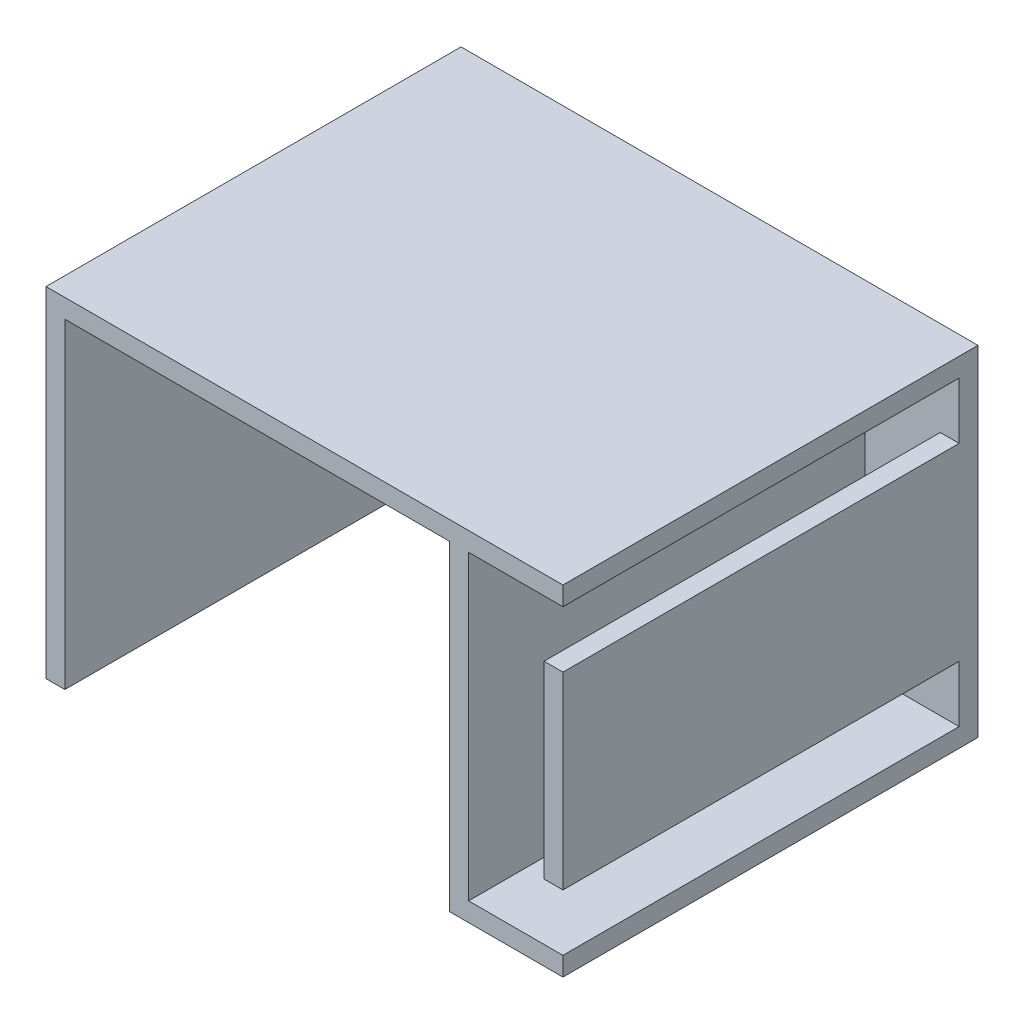
ISO-10303-21;
HEADER;
FILE_DESCRIPTION(('STEP AP214'),'2;1');
FILE_NAME('part.step','',(''),(''),'','','');
FILE_SCHEMA(('AUTOMOTIVE_DESIGN { 1 0 10303 214 1 1 1 1 }'));
ENDSEC;
DATA;
#1=APPLICATION_CONTEXT('core data for automotive mechanical design processes');
#2=APPLICATION_PROTOCOL_DEFINITION('international standard','automotive_design',2000,#1);
#3=PRODUCT_CONTEXT('',#1,'mechanical');
#4=PRODUCT('Part','Part','',(#3));
#5=PRODUCT_RELATED_PRODUCT_CATEGORY('part','',(#4));
#6=PRODUCT_DEFINITION_FORMATION('','',#4);
#7=PRODUCT_DEFINITION_CONTEXT('part definition',#1,'design');
#8=PRODUCT_DEFINITION('design','',#6,#7);
#9=PRODUCT_DEFINITION_SHAPE('','',#8);
#10=(LENGTH_UNIT() NAMED_UNIT(*) SI_UNIT(.MILLI.,.METRE.));
#11=(NAMED_UNIT(*) PLANE_ANGLE_UNIT() SI_UNIT($,.RADIAN.));
#12=(NAMED_UNIT(*) SI_UNIT($,.STERADIAN.) SOLID_ANGLE_UNIT());
#13=UNCERTAINTY_MEASURE_WITH_UNIT(LENGTH_MEASURE(1.E-05),#10,'distance_accuracy_value','');
#14=(GEOMETRIC_REPRESENTATION_CONTEXT(3) GLOBAL_UNCERTAINTY_ASSIGNED_CONTEXT((#13)) GLOBAL_UNIT_ASSIGNED_CONTEXT((#10,
#11,#12)) REPRESENTATION_CONTEXT('',''));
#15=CARTESIAN_POINT('',(0.,0.,0.));
#16=DIRECTION('',(0.,0.,1.));
#17=DIRECTION('',(1.,0.,0.));
#18=AXIS2_PLACEMENT_3D('',#15,#16,#17);
#19=CARTESIAN_POINT('',(22.4,0.,22.));
#20=DIRECTION('',(0.,0.,-1.));
#21=DIRECTION('',(1.,0.,0.));
#22=AXIS2_PLACEMENT_3D('',#19,#20,#21);
#23=PLANE('',#22);
#24=DIRECTION('',(0.,-1.,0.));
#25=VECTOR('',#24,1.);
#26=CARTESIAN_POINT('',(38.6,10.1,22.));
#27=LINE('',#26,#25);
#28=CARTESIAN_POINT('',(38.6,7.10000000000001,22.));
#29=VERTEX_POINT('',#28);
#30=CARTESIAN_POINT('',(38.6,-2.9,22.));
#31=VERTEX_POINT('',#30);
#32=EDGE_CURVE('E223',#29,#31,#27,.T.);
#33=ORIENTED_EDGE('',*,*,#32,.F.);
#34=DIRECTION('',(1.,0.,0.));
#35=VECTOR('',#34,1.);
#36=CARTESIAN_POINT('',(11.199,7.10000000000002,22.));
#37=LINE('',#36,#35);
#38=CARTESIAN_POINT('',(37.6,7.10000000000001,22.));
#39=VERTEX_POINT('',#38);
#40=EDGE_CURVE('E175',#39,#29,#37,.T.);
#41=ORIENTED_EDGE('',*,*,#40,.F.);
#42=DIRECTION('',(0.,1.,0.));
#43=VECTOR('',#42,1.);
#44=CARTESIAN_POINT('',(37.6,-5.89999999999999,22.));
#45=LINE('',#44,#43);
#46=CARTESIAN_POINT('',(37.6,-2.89999999999999,22.));
#47=VERTEX_POINT('',#46);
#48=EDGE_CURVE('E216',#47,#39,#45,.T.);
#49=ORIENTED_EDGE('',*,*,#48,.F.);
#50=DIRECTION('',(1.,0.,0.));
#51=VECTOR('',#50,1.);
#52=CARTESIAN_POINT('',(11.199,-2.89999999999999,22.));
#53=LINE('',#52,#51);
#54=EDGE_CURVE('E164',#47,#31,#53,.T.);
#55=ORIENTED_EDGE('',*,*,#54,.T.);
#56=EDGE_LOOP('',(#33,#41,#49,#55));
#57=FACE_BOUND('',#56,.T.);
#58=ADVANCED_FACE('F39',(#57),#23,.F.);
#59=CARTESIAN_POINT('',(32.6,-6.9,22.));
#60=DIRECTION('',(1.,0.,0.));
#61=DIRECTION('',(0.,-1.,0.));
#62=AXIS2_PLACEMENT_3D('',#59,#60,#61);
#63=PLANE('',#62);
#64=DIRECTION('',(0.,1.,0.));
#65=VECTOR('',#64,1.);
#66=CARTESIAN_POINT('',(32.6,-6.9,0.));
#67=LINE('',#66,#65);
#68=CARTESIAN_POINT('',(32.6,-6.9,0.));
#69=VERTEX_POINT('',#68);
#70=CARTESIAN_POINT('',(32.6,10.1,0.));
#71=VERTEX_POINT('',#70);
#72=EDGE_CURVE('E190',#69,#71,#67,.T.);
#73=ORIENTED_EDGE('',*,*,#72,.F.);
#74=DIRECTION('',(0.,0.,-1.));
#75=VECTOR('',#74,1.);
#76=CARTESIAN_POINT('',(32.6,-6.9,22.));
#77=LINE('',#76,#75);
#78=CARTESIAN_POINT('',(32.6,-6.9,22.));
#79=VERTEX_POINT('',#78);
#80=EDGE_CURVE('E225',#79,#69,#77,.T.);
#81=ORIENTED_EDGE('',*,*,#80,.F.);
#82=DIRECTION('',(0.,1.,0.));
#83=VECTOR('',#82,1.);
#84=CARTESIAN_POINT('',(32.6,-6.9,22.));
#85=LINE('',#84,#83);
#86=CARTESIAN_POINT('',(32.6,10.1,22.));
#87=VERTEX_POINT('',#86);
#88=EDGE_CURVE('E191',#79,#87,#85,.T.);
#89=ORIENTED_EDGE('',*,*,#88,.T.);
#90=DIRECTION('',(0.,0.,-1.));
#91=VECTOR('',#90,1.);
#92=CARTESIAN_POINT('',(32.6,10.1,22.));
#93=LINE('',#92,#91);
#94=EDGE_CURVE('E11',#87,#71,#93,.T.);
#95=ORIENTED_EDGE('',*,*,#94,.T.);
#96=EDGE_LOOP('',(#73,#81,#89,#95));
#97=FACE_BOUND('',#96,.T.);
#98=ADVANCED_FACE('F41',(#97),#63,.F.);
#99=CARTESIAN_POINT('',(32.6,10.1,22.));
#100=DIRECTION('',(0.,1.,0.));
#101=DIRECTION('',(0.,0.,1.));
#102=AXIS2_PLACEMENT_3D('',#99,#100,#101);
#103=PLANE('',#102);
#104=DIRECTION('',(-1.,0.,0.));
#105=VECTOR('',#104,1.);
#106=CARTESIAN_POINT('',(32.6,10.1,0.));
#107=LINE('',#106,#105);
#108=CARTESIAN_POINT('',(12.2,10.1,0.));
#109=VERTEX_POINT('',#108);
#110=EDGE_CURVE('E228',#71,#109,#107,.T.);
#111=ORIENTED_EDGE('',*,*,#110,.F.);
#112=ORIENTED_EDGE('',*,*,#94,.F.);
#113=DIRECTION('',(-1.,0.,0.));
#114=VECTOR('',#113,1.);
#115=CARTESIAN_POINT('',(32.6,10.1,22.));
#116=LINE('',#115,#114);
#117=CARTESIAN_POINT('',(12.2,10.1,22.));
#118=VERTEX_POINT('',#117);
#119=EDGE_CURVE('E194',#87,#118,#116,.T.);
#120=ORIENTED_EDGE('',*,*,#119,.T.);
#121=DIRECTION('',(0.,0.,-1.));
#122=VECTOR('',#121,1.);
#123=CARTESIAN_POINT('',(12.2,10.1,22.));
#124=LINE('',#123,#122);
#125=EDGE_CURVE('E47',#118,#109,#124,.T.);
#126=ORIENTED_EDGE('',*,*,#125,.T.);
#127=EDGE_LOOP('',(#111,#112,#120,#126));
#128=FACE_BOUND('',#127,.T.);
#129=ADVANCED_FACE('F266',(#128),#103,.F.);
#130=CARTESIAN_POINT('',(12.2,10.1,22.));
#131=DIRECTION('',(-1.,0.,0.));
#132=DIRECTION('',(0.,0.,-1.));
#133=AXIS2_PLACEMENT_3D('',#130,#131,#132);
#134=PLANE('',#133);
#135=DIRECTION('',(0.,-1.,0.));
#136=VECTOR('',#135,1.);
#137=CARTESIAN_POINT('',(12.2,10.1,0.));
#138=LINE('',#137,#136);
#139=CARTESIAN_POINT('',(12.2,-6.9,0.));
#140=VERTEX_POINT('',#139);
#141=EDGE_CURVE('E231',#109,#140,#138,.T.);
#142=ORIENTED_EDGE('',*,*,#141,.F.);
#143=ORIENTED_EDGE('',*,*,#125,.F.);
#144=DIRECTION('',(0.,-1.,0.));
#145=VECTOR('',#144,1.);
#146=CARTESIAN_POINT('',(12.2,10.1,22.));
#147=LINE('',#146,#145);
#148=CARTESIAN_POINT('',(12.2,-6.9,22.));
#149=VERTEX_POINT('',#148);
#150=EDGE_CURVE('E198',#118,#149,#147,.T.);
#151=ORIENTED_EDGE('',*,*,#150,.T.);
#152=DIRECTION('',(0.,0.,-1.));
#153=VECTOR('',#152,1.);
#154=CARTESIAN_POINT('',(12.2,-6.9,22.));
#155=LINE('',#154,#153);
#156=EDGE_CURVE('E261',#149,#140,#155,.T.);
#157=ORIENTED_EDGE('',*,*,#156,.T.);
#158=EDGE_LOOP('',(#142,#143,#151,#157));
#159=FACE_BOUND('',#158,.T.);
#160=ADVANCED_FACE('F279',(#159),#134,.F.);
#161=CARTESIAN_POINT('',(12.2,-6.9,22.));
#162=DIRECTION('',(0.,1.,0.));
#163=DIRECTION('',(1.,0.,0.));
#164=AXIS2_PLACEMENT_3D('',#161,#162,#163);
#165=PLANE('',#164);
#166=DIRECTION('',(-1.,0.,0.));
#167=VECTOR('',#166,1.);
#168=CARTESIAN_POINT('',(12.2,-6.9,0.));
#169=LINE('',#168,#167);
#170=CARTESIAN_POINT('',(11.2,-6.9,0.));
#171=VERTEX_POINT('',#170);
#172=EDGE_CURVE('E234',#140,#171,#169,.T.);
#173=ORIENTED_EDGE('',*,*,#172,.F.);
#174=ORIENTED_EDGE('',*,*,#156,.F.);
#175=DIRECTION('',(-1.,0.,0.));
#176=VECTOR('',#175,1.);
#177=CARTESIAN_POINT('',(12.2,-6.9,22.));
#178=LINE('',#177,#176);
#179=CARTESIAN_POINT('',(11.2,-6.9,22.));
#180=VERTEX_POINT('',#179);
#181=EDGE_CURVE('E201',#149,#180,#178,.T.);
#182=ORIENTED_EDGE('',*,*,#181,.T.);
#183=DIRECTION('',(0.,0.,-1.));
#184=VECTOR('',#183,1.);
#185=CARTESIAN_POINT('',(11.2,-6.9,22.));
#186=LINE('',#185,#184);
#187=EDGE_CURVE('E258',#180,#171,#186,.T.);
#188=ORIENTED_EDGE('',*,*,#187,.T.);
#189=EDGE_LOOP('',(#173,#174,#182,#188));
#190=FACE_BOUND('',#189,.T.);
#191=ADVANCED_FACE('F281',(#190),#165,.F.);
#192=CARTESIAN_POINT('',(11.2,-6.9,22.));
#193=DIRECTION('',(1.,0.,0.));
#194=DIRECTION('',(0.,-1.,0.));
#195=AXIS2_PLACEMENT_3D('',#192,#193,#194);
#196=PLANE('',#195);
#197=DIRECTION('',(0.,1.,0.));
#198=VECTOR('',#197,1.);
#199=CARTESIAN_POINT('',(11.2,-6.9,0.));
#200=LINE('',#199,#198);
#201=CARTESIAN_POINT('',(11.2,11.1,0.));
#202=VERTEX_POINT('',#201);
#203=EDGE_CURVE('E237',#171,#202,#200,.T.);
#204=ORIENTED_EDGE('',*,*,#203,.F.);
#205=ORIENTED_EDGE('',*,*,#187,.F.);
#206=DIRECTION('',(0.,1.,0.));
#207=VECTOR('',#206,1.);
#208=CARTESIAN_POINT('',(11.2,-6.9,22.));
#209=LINE('',#208,#207);
#210=CARTESIAN_POINT('',(11.2,11.1,22.));
#211=VERTEX_POINT('',#210);
#212=EDGE_CURVE('E204',#180,#211,#209,.T.);
#213=ORIENTED_EDGE('',*,*,#212,.T.);
#214=DIRECTION('',(0.,0.,-1.));
#215=VECTOR('',#214,1.);
#216=CARTESIAN_POINT('',(11.2,11.1,22.));
#217=LINE('',#216,#215);
#218=EDGE_CURVE('E255',#211,#202,#217,.T.);
#219=ORIENTED_EDGE('',*,*,#218,.T.);
#220=EDGE_LOOP('',(#204,#205,#213,#219));
#221=FACE_BOUND('',#220,.T.);
#222=ADVANCED_FACE('F284',(#221),#196,.F.);
#223=CARTESIAN_POINT('',(11.2,11.1,22.));
#224=DIRECTION('',(0.,-1.,0.));
#225=DIRECTION('',(-1.,0.,0.));
#226=AXIS2_PLACEMENT_3D('',#223,#224,#225);
#227=PLANE('',#226);
#228=DIRECTION('',(1.,0.,0.));
#229=VECTOR('',#228,1.);
#230=CARTESIAN_POINT('',(11.2,11.1,0.));
#231=LINE('',#230,#229);
#232=CARTESIAN_POINT('',(38.6,11.1,0.));
#233=VERTEX_POINT('',#232);
#234=EDGE_CURVE('E240',#202,#233,#231,.T.);
#235=ORIENTED_EDGE('',*,*,#234,.F.);
#236=ORIENTED_EDGE('',*,*,#218,.F.);
#237=DIRECTION('',(1.,0.,0.));
#238=VECTOR('',#237,1.);
#239=CARTESIAN_POINT('',(11.2,11.1,22.));
#240=LINE('',#239,#238);
#241=CARTESIAN_POINT('',(38.6,11.1,22.));
#242=VERTEX_POINT('',#241);
#243=EDGE_CURVE('E207',#211,#242,#240,.T.);
#244=ORIENTED_EDGE('',*,*,#243,.T.);
#245=DIRECTION('',(0.,0.,1.));
#246=VECTOR('',#245,1.);
#247=CARTESIAN_POINT('',(38.6,11.1,-5.09901951359278));
#248=LINE('',#247,#246);
#249=EDGE_CURVE('E184',#233,#242,#248,.T.);
#250=ORIENTED_EDGE('',*,*,#249,.F.);
#251=EDGE_LOOP('',(#235,#236,#244,#250));
#252=FACE_BOUND('',#251,.T.);
#253=ADVANCED_FACE('F287',(#252),#227,.F.);
#254=CARTESIAN_POINT('',(33.6,11.1,22.));
#255=DIRECTION('',(-1.,0.,0.));
#256=DIRECTION('',(0.,0.,-1.));
#257=AXIS2_PLACEMENT_3D('',#254,#255,#256);
#258=PLANE('',#257);
#259=DIRECTION('',(0.,-1.,0.));
#260=VECTOR('',#259,1.);
#261=CARTESIAN_POINT('',(33.6,11.1,22.));
#262=LINE('',#261,#260);
#263=CARTESIAN_POINT('',(33.6,10.1,22.));
#264=VERTEX_POINT('',#263);
#265=CARTESIAN_POINT('',(33.6,-5.89999999999999,22.));
#266=VERTEX_POINT('',#265);
#267=EDGE_CURVE('E210',#264,#266,#262,.T.);
#268=ORIENTED_EDGE('',*,*,#267,.T.);
#269=DIRECTION('',(0.,0.,-1.));
#270=VECTOR('',#269,1.);
#271=CARTESIAN_POINT('',(33.6,-5.89999999999999,22.));
#272=LINE('',#271,#270);
#273=CARTESIAN_POINT('',(33.6,-5.89999999999999,1.));
#274=VERTEX_POINT('',#273);
#275=EDGE_CURVE('E252',#266,#274,#272,.T.);
#276=ORIENTED_EDGE('',*,*,#275,.T.);
#277=DIRECTION('',(0.,-1.,0.));
#278=VECTOR('',#277,1.);
#279=CARTESIAN_POINT('',(33.6,10.1,1.));
#280=LINE('',#279,#278);
#281=CARTESIAN_POINT('',(33.6,10.1,0.999999999999998));
#282=VERTEX_POINT('',#281);
#283=EDGE_CURVE('E182',#282,#274,#280,.T.);
#284=ORIENTED_EDGE('',*,*,#283,.F.);
#285=DIRECTION('',(0.,0.,1.));
#286=VECTOR('',#285,1.);
#287=CARTESIAN_POINT('',(33.6,10.1,-5.09901951359278));
#288=LINE('',#287,#286);
#289=EDGE_CURVE('E180',#282,#264,#288,.T.);
#290=ORIENTED_EDGE('',*,*,#289,.T.);
#291=EDGE_LOOP('',(#268,#276,#284,#290));
#292=FACE_BOUND('',#291,.T.);
#293=ADVANCED_FACE('F325',(#292),#258,.F.);
#294=CARTESIAN_POINT('',(33.6,-5.89999999999999,22.));
#295=DIRECTION('',(0.,-1.,0.));
#296=DIRECTION('',(-1.,0.,0.));
#297=AXIS2_PLACEMENT_3D('',#294,#295,#296);
#298=PLANE('',#297);
#299=ORIENTED_EDGE('',*,*,#275,.F.);
#300=DIRECTION('',(1.,0.,0.));
#301=VECTOR('',#300,1.);
#302=CARTESIAN_POINT('',(33.6,-5.89999999999999,22.));
#303=LINE('',#302,#301);
#304=CARTESIAN_POINT('',(38.6,-5.9,22.));
#305=VERTEX_POINT('',#304);
#306=EDGE_CURVE('E213',#266,#305,#303,.T.);
#307=ORIENTED_EDGE('',*,*,#306,.T.);
#308=DIRECTION('',(0.,0.,1.));
#309=VECTOR('',#308,1.);
#310=CARTESIAN_POINT('',(38.6,-5.9,1.));
#311=LINE('',#310,#309);
#312=CARTESIAN_POINT('',(38.6,-5.9,1.));
#313=VERTEX_POINT('',#312);
#314=EDGE_CURVE('E165',#313,#305,#311,.T.);
#315=ORIENTED_EDGE('',*,*,#314,.F.);
#316=DIRECTION('',(1.,0.,0.));
#317=VECTOR('',#316,1.);
#318=CARTESIAN_POINT('',(37.6,-5.89999999999999,1.));
#319=LINE('',#318,#317);
#320=EDGE_CURVE('E62',#274,#313,#319,.T.);
#321=ORIENTED_EDGE('',*,*,#320,.F.);
#322=EDGE_LOOP('',(#299,#307,#315,#321));
#323=FACE_BOUND('',#322,.T.);
#324=ADVANCED_FACE('F312',(#323),#298,.F.);
#325=CARTESIAN_POINT('',(37.6,-5.89999999999999,22.));
#326=DIRECTION('',(1.,0.,0.));
#327=DIRECTION('',(0.,-1.,0.));
#328=AXIS2_PLACEMENT_3D('',#325,#326,#327);
#329=PLANE('',#328);
#330=ORIENTED_EDGE('',*,*,#48,.T.);
#331=DIRECTION('',(0.,0.,-1.));
#332=VECTOR('',#331,1.);
#333=CARTESIAN_POINT('',(37.6,7.10000000000001,22.));
#334=LINE('',#333,#332);
#335=CARTESIAN_POINT('',(37.6,7.10000000000001,1.));
#336=VERTEX_POINT('',#335);
#337=EDGE_CURVE('E178',#39,#336,#334,.T.);
#338=ORIENTED_EDGE('',*,*,#337,.T.);
#339=DIRECTION('',(0.,1.,0.));
#340=VECTOR('',#339,1.);
#341=CARTESIAN_POINT('',(37.6,10.1,1.));
#342=LINE('',#341,#340);
#343=CARTESIAN_POINT('',(37.6,-2.9,1.));
#344=VERTEX_POINT('',#343);
#345=EDGE_CURVE('E159',#344,#336,#342,.T.);
#346=ORIENTED_EDGE('',*,*,#345,.F.);
#347=DIRECTION('',(0.,0.,1.));
#348=VECTOR('',#347,1.);
#349=CARTESIAN_POINT('',(37.6,-2.9,1.));
#350=LINE('',#349,#348);
#351=EDGE_CURVE('E168',#344,#47,#350,.T.);
#352=ORIENTED_EDGE('',*,*,#351,.T.);
#353=EDGE_LOOP('',(#330,#338,#346,#352));
#354=FACE_BOUND('',#353,.T.);
#355=ADVANCED_FACE('F177',(#354),#329,.F.);
#356=CARTESIAN_POINT('',(38.6,10.1,22.));
#357=DIRECTION('',(-1.,0.,0.));
#358=DIRECTION('',(0.,0.,-1.));
#359=AXIS2_PLACEMENT_3D('',#356,#357,#358);
#360=PLANE('',#359);
#361=DIRECTION('',(0.,-1.,0.));
#362=VECTOR('',#361,1.);
#363=CARTESIAN_POINT('',(38.6,-5.9,1.));
#364=LINE('',#363,#362);
#365=CARTESIAN_POINT('',(38.6,-2.9,1.));
#366=VERTEX_POINT('',#365);
#367=EDGE_CURVE('E161',#366,#313,#364,.T.);
#368=ORIENTED_EDGE('',*,*,#367,.T.);
#369=ORIENTED_EDGE('',*,*,#314,.T.);
#370=CARTESIAN_POINT('',(38.6,-6.90000000000001,22.));
#371=VERTEX_POINT('',#370);
#372=EDGE_CURVE('E218',#305,#371,#27,.T.);
#373=ORIENTED_EDGE('',*,*,#372,.T.);
#374=DIRECTION('',(0.,0.,-1.));
#375=VECTOR('',#374,1.);
#376=CARTESIAN_POINT('',(38.6,-6.90000000000001,22.));
#377=LINE('',#376,#375);
#378=CARTESIAN_POINT('',(38.6,-6.90000000000001,0.));
#379=VERTEX_POINT('',#378);
#380=EDGE_CURVE('E249',#371,#379,#377,.T.);
#381=ORIENTED_EDGE('',*,*,#380,.T.);
#382=DIRECTION('',(0.,-1.,0.));
#383=VECTOR('',#382,1.);
#384=CARTESIAN_POINT('',(38.6,10.1,0.));
#385=LINE('',#384,#383);
#386=EDGE_CURVE('E243',#233,#379,#385,.T.);
#387=ORIENTED_EDGE('',*,*,#386,.F.);
#388=ORIENTED_EDGE('',*,*,#249,.T.);
#389=CARTESIAN_POINT('',(38.6,10.1,22.));
#390=VERTEX_POINT('',#389);
#391=EDGE_CURVE('E219',#242,#390,#27,.T.);
#392=ORIENTED_EDGE('',*,*,#391,.T.);
#393=DIRECTION('',(0.,0.,-1.));
#394=VECTOR('',#393,1.);
#395=CARTESIAN_POINT('',(38.6,10.1,22.));
#396=LINE('',#395,#394);
#397=CARTESIAN_POINT('',(38.6,10.1,1.));
#398=VERTEX_POINT('',#397);
#399=EDGE_CURVE('E300',#390,#398,#396,.T.);
#400=ORIENTED_EDGE('',*,*,#399,.T.);
#401=DIRECTION('',(0.,-1.,0.));
#402=VECTOR('',#401,1.);
#403=CARTESIAN_POINT('',(38.6,10.1,1.));
#404=LINE('',#403,#402);
#405=CARTESIAN_POINT('',(38.6,7.10000000000001,1.));
#406=VERTEX_POINT('',#405);
#407=EDGE_CURVE('E303',#398,#406,#404,.T.);
#408=ORIENTED_EDGE('',*,*,#407,.T.);
#409=DIRECTION('',(0.,0.,1.));
#410=VECTOR('',#409,1.);
#411=CARTESIAN_POINT('',(38.6,7.10000000000001,22.));
#412=LINE('',#411,#410);
#413=EDGE_CURVE('E296',#406,#29,#412,.T.);
#414=ORIENTED_EDGE('',*,*,#413,.T.);
#415=ORIENTED_EDGE('',*,*,#32,.T.);
#416=DIRECTION('',(0.,0.,-1.));
#417=VECTOR('',#416,1.);
#418=CARTESIAN_POINT('',(38.6,-2.9,1.));
#419=LINE('',#418,#417);
#420=EDGE_CURVE('E174',#31,#366,#419,.T.);
#421=ORIENTED_EDGE('',*,*,#420,.T.);
#422=EDGE_LOOP('',(#368,#369,#373,#381,#387,#388,#392,#400,#408,#414,#415,#421));
#423=FACE_BOUND('',#422,.T.);
#424=ADVANCED_FACE('F311',(#423),#360,.F.);
#425=CARTESIAN_POINT('',(32.6,-6.9,22.));
#426=DIRECTION('',(0.,1.,0.));
#427=DIRECTION('',(1.,0.,0.));
#428=AXIS2_PLACEMENT_3D('',#425,#426,#427);
#429=PLANE('',#428);
#430=DIRECTION('',(-1.,0.,0.));
#431=VECTOR('',#430,1.);
#432=CARTESIAN_POINT('',(32.6,-6.9,0.));
#433=LINE('',#432,#431);
#434=EDGE_CURVE('E195',#379,#69,#433,.T.);
#435=ORIENTED_EDGE('',*,*,#434,.F.);
#436=ORIENTED_EDGE('',*,*,#380,.F.);
#437=DIRECTION('',(-1.,0.,0.));
#438=VECTOR('',#437,1.);
#439=CARTESIAN_POINT('',(32.6,-6.9,22.));
#440=LINE('',#439,#438);
#441=EDGE_CURVE('E222',#371,#79,#440,.T.);
#442=ORIENTED_EDGE('',*,*,#441,.T.);
#443=ORIENTED_EDGE('',*,*,#80,.T.);
#444=EDGE_LOOP('',(#435,#436,#442,#443));
#445=FACE_BOUND('',#444,.T.);
#446=ADVANCED_FACE('F342',(#445),#429,.F.);
#447=ORIENTED_EDGE('',*,*,#306,.F.);
#448=ORIENTED_EDGE('',*,*,#267,.F.);
#449=DIRECTION('',(-1.,0.,0.));
#450=VECTOR('',#449,1.);
#451=CARTESIAN_POINT('',(33.6,10.1,22.));
#452=LINE('',#451,#450);
#453=EDGE_CURVE('E54',#390,#264,#452,.T.);
#454=ORIENTED_EDGE('',*,*,#453,.F.);
#455=ORIENTED_EDGE('',*,*,#391,.F.);
#456=ORIENTED_EDGE('',*,*,#243,.F.);
#457=ORIENTED_EDGE('',*,*,#212,.F.);
#458=ORIENTED_EDGE('',*,*,#181,.F.);
#459=ORIENTED_EDGE('',*,*,#150,.F.);
#460=ORIENTED_EDGE('',*,*,#119,.F.);
#461=ORIENTED_EDGE('',*,*,#88,.F.);
#462=ORIENTED_EDGE('',*,*,#441,.F.);
#463=ORIENTED_EDGE('',*,*,#372,.F.);
#464=EDGE_LOOP('',(#447,#448,#454,#455,#456,#457,#458,#459,#460,#461,#462,#463));
#465=FACE_BOUND('',#464,.T.);
#466=ADVANCED_FACE('F276',(#465),#23,.F.);
#467=CARTESIAN_POINT('',(22.4,0.,0.));
#468=DIRECTION('',(0.,0.,-1.));
#469=DIRECTION('',(1.,0.,0.));
#470=AXIS2_PLACEMENT_3D('',#467,#468,#469);
#471=PLANE('',#470);
#472=ORIENTED_EDGE('',*,*,#386,.T.);
#473=ORIENTED_EDGE('',*,*,#434,.T.);
#474=ORIENTED_EDGE('',*,*,#72,.T.);
#475=ORIENTED_EDGE('',*,*,#110,.T.);
#476=ORIENTED_EDGE('',*,*,#141,.T.);
#477=ORIENTED_EDGE('',*,*,#172,.T.);
#478=ORIENTED_EDGE('',*,*,#203,.T.);
#479=ORIENTED_EDGE('',*,*,#234,.T.);
#480=EDGE_LOOP('',(#472,#473,#474,#475,#476,#477,#478,#479));
#481=FACE_BOUND('',#480,.T.);
#482=ADVANCED_FACE('F270',(#481),#471,.T.);
#483=CARTESIAN_POINT('',(22.4,0.,1.));
#484=DIRECTION('',(0.,0.,1.));
#485=DIRECTION('',(-1.,0.,0.));
#486=AXIS2_PLACEMENT_3D('',#483,#484,#485);
#487=PLANE('',#486);
#488=ORIENTED_EDGE('',*,*,#345,.T.);
#489=DIRECTION('',(1.,0.,0.));
#490=VECTOR('',#489,1.);
#491=CARTESIAN_POINT('',(11.199,7.10000000000001,1.));
#492=LINE('',#491,#490);
#493=EDGE_CURVE('E294',#336,#406,#492,.T.);
#494=ORIENTED_EDGE('',*,*,#493,.T.);
#495=ORIENTED_EDGE('',*,*,#407,.F.);
#496=DIRECTION('',(-1.,0.,0.));
#497=VECTOR('',#496,1.);
#498=CARTESIAN_POINT('',(37.6,10.1,1.));
#499=LINE('',#498,#497);
#500=EDGE_CURVE('E179',#398,#282,#499,.T.);
#501=ORIENTED_EDGE('',*,*,#500,.T.);
#502=ORIENTED_EDGE('',*,*,#283,.T.);
#503=ORIENTED_EDGE('',*,*,#320,.T.);
#504=ORIENTED_EDGE('',*,*,#367,.F.);
#505=DIRECTION('',(1.,0.,0.));
#506=VECTOR('',#505,1.);
#507=CARTESIAN_POINT('',(11.199,-2.89999999999999,1.));
#508=LINE('',#507,#506);
#509=EDGE_CURVE('E155',#344,#366,#508,.T.);
#510=ORIENTED_EDGE('',*,*,#509,.F.);
#511=EDGE_LOOP('',(#488,#494,#495,#501,#502,#503,#504,#510));
#512=FACE_BOUND('',#511,.T.);
#513=ADVANCED_FACE('F157',(#512),#487,.T.);
#514=CARTESIAN_POINT('',(33.6,10.1,-5.09901951359278));
#515=DIRECTION('',(0.,-1.,0.));
#516=DIRECTION('',(0.,0.,-1.));
#517=AXIS2_PLACEMENT_3D('',#514,#515,#516);
#518=PLANE('',#517);
#519=ORIENTED_EDGE('',*,*,#453,.T.);
#520=ORIENTED_EDGE('',*,*,#289,.F.);
#521=ORIENTED_EDGE('',*,*,#500,.F.);
#522=ORIENTED_EDGE('',*,*,#399,.F.);
#523=EDGE_LOOP('',(#519,#520,#521,#522));
#524=FACE_BOUND('',#523,.T.);
#525=ADVANCED_FACE('F322',(#524),#518,.T.);
#526=CARTESIAN_POINT('',(11.199,7.10000000000002,22.));
#527=DIRECTION('',(0.,-1.,0.));
#528=DIRECTION('',(0.,0.,-1.));
#529=AXIS2_PLACEMENT_3D('',#526,#527,#528);
#530=PLANE('',#529);
#531=ORIENTED_EDGE('',*,*,#337,.F.);
#532=ORIENTED_EDGE('',*,*,#40,.T.);
#533=ORIENTED_EDGE('',*,*,#413,.F.);
#534=ORIENTED_EDGE('',*,*,#493,.F.);
#535=EDGE_LOOP('',(#531,#532,#533,#534));
#536=FACE_BOUND('',#535,.T.);
#537=ADVANCED_FACE('F320',(#536),#530,.F.);
#538=CARTESIAN_POINT('',(11.199,-2.89999999999999,1.));
#539=DIRECTION('',(0.,1.,0.));
#540=DIRECTION('',(1.,0.,0.));
#541=AXIS2_PLACEMENT_3D('',#538,#539,#540);
#542=PLANE('',#541);
#543=ORIENTED_EDGE('',*,*,#351,.F.);
#544=ORIENTED_EDGE('',*,*,#509,.T.);
#545=ORIENTED_EDGE('',*,*,#420,.F.);
#546=ORIENTED_EDGE('',*,*,#54,.F.);
#547=EDGE_LOOP('',(#543,#544,#545,#546));
#548=FACE_BOUND('',#547,.T.);
#549=ADVANCED_FACE('F169',(#548),#542,.F.);
#550=CLOSED_SHELL('',(#58,#98,#129,#160,#191,#222,#253,#293,#324,#355,#424,#446,#466,#482,#513,
#525,#537,#549));
#551=MANIFOLD_SOLID_BREP('B2',#550);
#552=ADVANCED_BREP_SHAPE_REPRESENTATION('',(#18,#551),#14);
#553=SHAPE_DEFINITION_REPRESENTATION(#9,#552);
ENDSEC;
END-ISO-10303-21;
